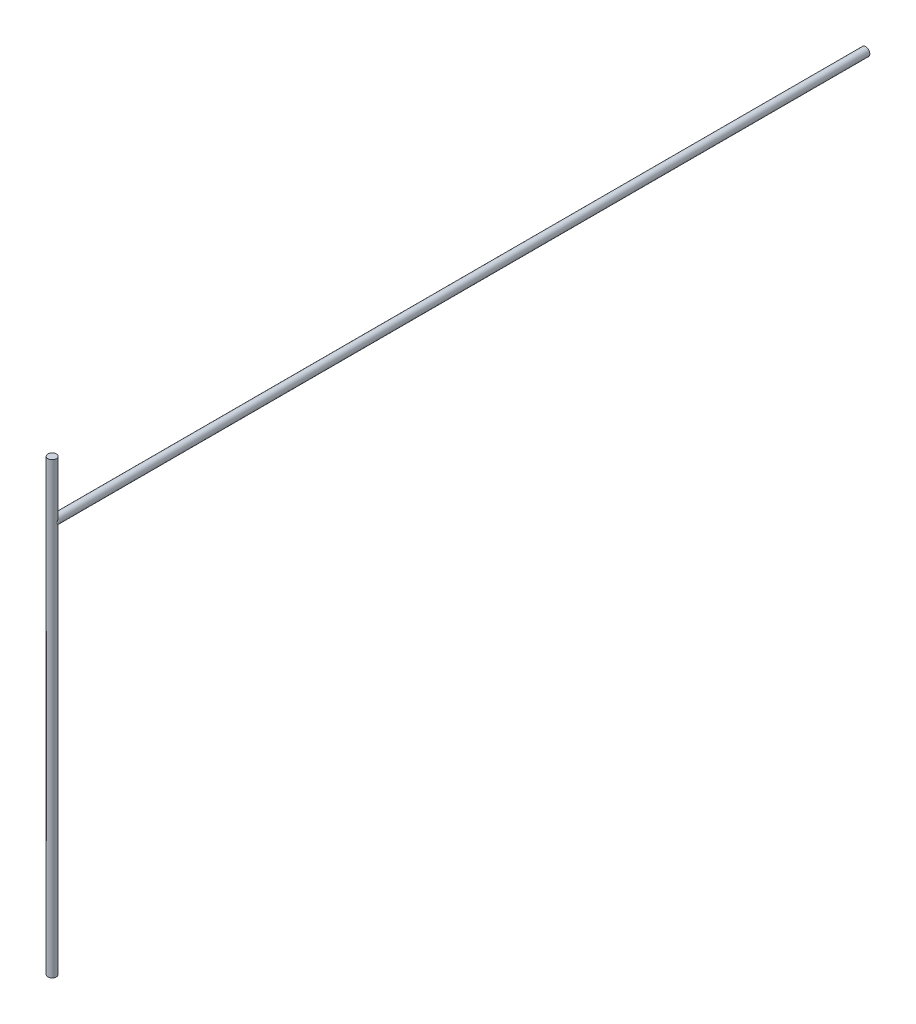
ISO-10303-21;
HEADER;
FILE_DESCRIPTION(('STEP AP214'),'2;1');
FILE_NAME('part.step','',(''),(''),'','','');
FILE_SCHEMA(('AUTOMOTIVE_DESIGN { 1 0 10303 214 1 1 1 1 }'));
ENDSEC;
DATA;
#1=APPLICATION_CONTEXT('core data for automotive mechanical design processes');
#2=APPLICATION_PROTOCOL_DEFINITION('international standard','automotive_design',2000,#1);
#3=PRODUCT_CONTEXT('',#1,'mechanical');
#4=PRODUCT('Part','Part','',(#3));
#5=PRODUCT_RELATED_PRODUCT_CATEGORY('part','',(#4));
#6=PRODUCT_DEFINITION_FORMATION('','',#4);
#7=PRODUCT_DEFINITION_CONTEXT('part definition',#1,'design');
#8=PRODUCT_DEFINITION('design','',#6,#7);
#9=PRODUCT_DEFINITION_SHAPE('','',#8);
#10=(LENGTH_UNIT() NAMED_UNIT(*) SI_UNIT(.MILLI.,.METRE.));
#11=(NAMED_UNIT(*) PLANE_ANGLE_UNIT() SI_UNIT($,.RADIAN.));
#12=(NAMED_UNIT(*) SI_UNIT($,.STERADIAN.) SOLID_ANGLE_UNIT());
#13=UNCERTAINTY_MEASURE_WITH_UNIT(LENGTH_MEASURE(1.E-05),#10,'distance_accuracy_value','');
#14=(GEOMETRIC_REPRESENTATION_CONTEXT(3) GLOBAL_UNCERTAINTY_ASSIGNED_CONTEXT((#13)) GLOBAL_UNIT_ASSIGNED_CONTEXT((#10,
#11,#12)) REPRESENTATION_CONTEXT('',''));
#15=CARTESIAN_POINT('',(0.,0.,0.));
#16=DIRECTION('',(0.,0.,1.));
#17=DIRECTION('',(1.,0.,0.));
#18=AXIS2_PLACEMENT_3D('',#15,#16,#17);
#19=CARTESIAN_POINT('',(0.,-70.,0.));
#20=DIRECTION('',(0.,1.,0.));
#21=DIRECTION('',(0.,0.,-1.));
#22=AXIS2_PLACEMENT_3D('',#19,#20,#21);
#23=CYLINDRICAL_SURFACE('',#22,0.75);
#24=CARTESIAN_POINT('',(0.,10.,0.));
#25=DIRECTION('',(0.,1.,0.));
#26=DIRECTION('',(0.,0.,-1.));
#27=AXIS2_PLACEMENT_3D('',#24,#25,#26);
#28=CIRCLE('',#27,0.75);
#29=CARTESIAN_POINT('',(0.,10.,-0.75));
#30=VERTEX_POINT('',#29);
#31=EDGE_CURVE('E57',#30,#30,#28,.T.);
#32=ORIENTED_EDGE('',*,*,#31,.F.);
#33=EDGE_LOOP('',(#32));
#34=FACE_BOUND('',#33,.T.);
#35=CARTESIAN_POINT('',(0.,-70.,0.));
#36=DIRECTION('',(0.,1.,0.));
#37=DIRECTION('',(0.,0.,-1.));
#38=AXIS2_PLACEMENT_3D('',#35,#36,#37);
#39=CIRCLE('',#38,0.75);
#40=CARTESIAN_POINT('',(0.,-70.,-0.75));
#41=VERTEX_POINT('',#40);
#42=EDGE_CURVE('E52',#41,#41,#39,.T.);
#43=ORIENTED_EDGE('',*,*,#42,.T.);
#44=EDGE_LOOP('',(#43));
#45=FACE_BOUND('',#44,.T.);
#46=CARTESIAN_POINT('',(0.,0.,0.));
#47=DIRECTION('',(0.,0.707106781186547,0.707106781186547));
#48=DIRECTION('',(0.,-0.707106781186547,0.707106781186547));
#49=AXIS2_PLACEMENT_3D('',#46,#47,#48);
#50=ELLIPSE('',#49,1.06066017177982,0.75);
#51=CARTESIAN_POINT('',(-0.75,0.,0.));
#52=VERTEX_POINT('',#51);
#53=CARTESIAN_POINT('',(0.75,0.,0.));
#54=VERTEX_POINT('',#53);
#55=EDGE_CURVE('E43',#52,#54,#50,.F.);
#56=ORIENTED_EDGE('',*,*,#55,.F.);
#57=CARTESIAN_POINT('',(0.,0.,0.));
#58=DIRECTION('',(0.,-0.707106781186547,0.707106781186547));
#59=DIRECTION('',(0.,0.707106781186547,0.707106781186547));
#60=AXIS2_PLACEMENT_3D('',#57,#58,#59);
#61=ELLIPSE('',#60,1.06066017177982,0.75);
#62=EDGE_CURVE('E50',#54,#52,#61,.F.);
#63=ORIENTED_EDGE('',*,*,#62,.F.);
#64=EDGE_LOOP('',(#56,#63));
#65=FACE_BOUND('',#64,.T.);
#66=ADVANCED_FACE('F35',(#34,#45,#65),#23,.T.);
#67=CARTESIAN_POINT('',(0.,-70.,0.));
#68=DIRECTION('',(0.,1.,0.));
#69=DIRECTION('',(0.,0.,-1.));
#70=AXIS2_PLACEMENT_3D('',#67,#68,#69);
#71=PLANE('',#70);
#72=ORIENTED_EDGE('',*,*,#42,.F.);
#73=EDGE_LOOP('',(#72));
#74=FACE_BOUND('',#73,.T.);
#75=ADVANCED_FACE('F65',(#74),#71,.F.);
#76=CARTESIAN_POINT('',(0.,10.,0.));
#77=DIRECTION('',(0.,1.,0.));
#78=DIRECTION('',(0.,0.,-1.));
#79=AXIS2_PLACEMENT_3D('',#76,#77,#78);
#80=PLANE('',#79);
#81=ORIENTED_EDGE('',*,*,#31,.T.);
#82=EDGE_LOOP('',(#81));
#83=FACE_BOUND('',#82,.T.);
#84=ADVANCED_FACE('F61',(#83),#80,.T.);
#85=CARTESIAN_POINT('',(-1.01252958826451E-12,0.,-145.));
#86=DIRECTION('',(0.,0.,1.));
#87=DIRECTION('',(1.,0.,0.));
#88=AXIS2_PLACEMENT_3D('',#85,#86,#87);
#89=CYLINDRICAL_SURFACE('',#88,0.75);
#90=CARTESIAN_POINT('',(-1.01252958826451E-12,0.,-145.));
#91=DIRECTION('',(0.,0.,-1.));
#92=DIRECTION('',(-1.,0.,0.));
#93=AXIS2_PLACEMENT_3D('',#90,#91,#92);
#94=CIRCLE('',#93,0.75);
#95=CARTESIAN_POINT('',(-0.750000000001013,0.,-145.));
#96=VERTEX_POINT('',#95);
#97=EDGE_CURVE('E11',#96,#96,#94,.T.);
#98=ORIENTED_EDGE('',*,*,#97,.F.);
#99=EDGE_LOOP('',(#98));
#100=FACE_BOUND('',#99,.T.);
#101=ORIENTED_EDGE('',*,*,#62,.T.);
#102=ORIENTED_EDGE('',*,*,#55,.T.);
#103=EDGE_LOOP('',(#101,#102));
#104=FACE_BOUND('',#103,.T.);
#105=ADVANCED_FACE('F37',(#100,#104),#89,.T.);
#106=CARTESIAN_POINT('',(-1.01252958826451E-12,0.,-145.));
#107=DIRECTION('',(0.,0.,-1.));
#108=DIRECTION('',(-1.,0.,0.));
#109=AXIS2_PLACEMENT_3D('',#106,#107,#108);
#110=PLANE('',#109);
#111=ORIENTED_EDGE('',*,*,#97,.T.);
#112=EDGE_LOOP('',(#111));
#113=FACE_BOUND('',#112,.T.);
#114=ADVANCED_FACE('F75',(#113),#110,.T.);
#115=CLOSED_SHELL('',(#66,#75,#84,#105,#114));
#116=MANIFOLD_SOLID_BREP('B2',#115);
#117=ADVANCED_BREP_SHAPE_REPRESENTATION('',(#18,#116),#14);
#118=SHAPE_DEFINITION_REPRESENTATION(#9,#117);
ENDSEC;
END-ISO-10303-21;
